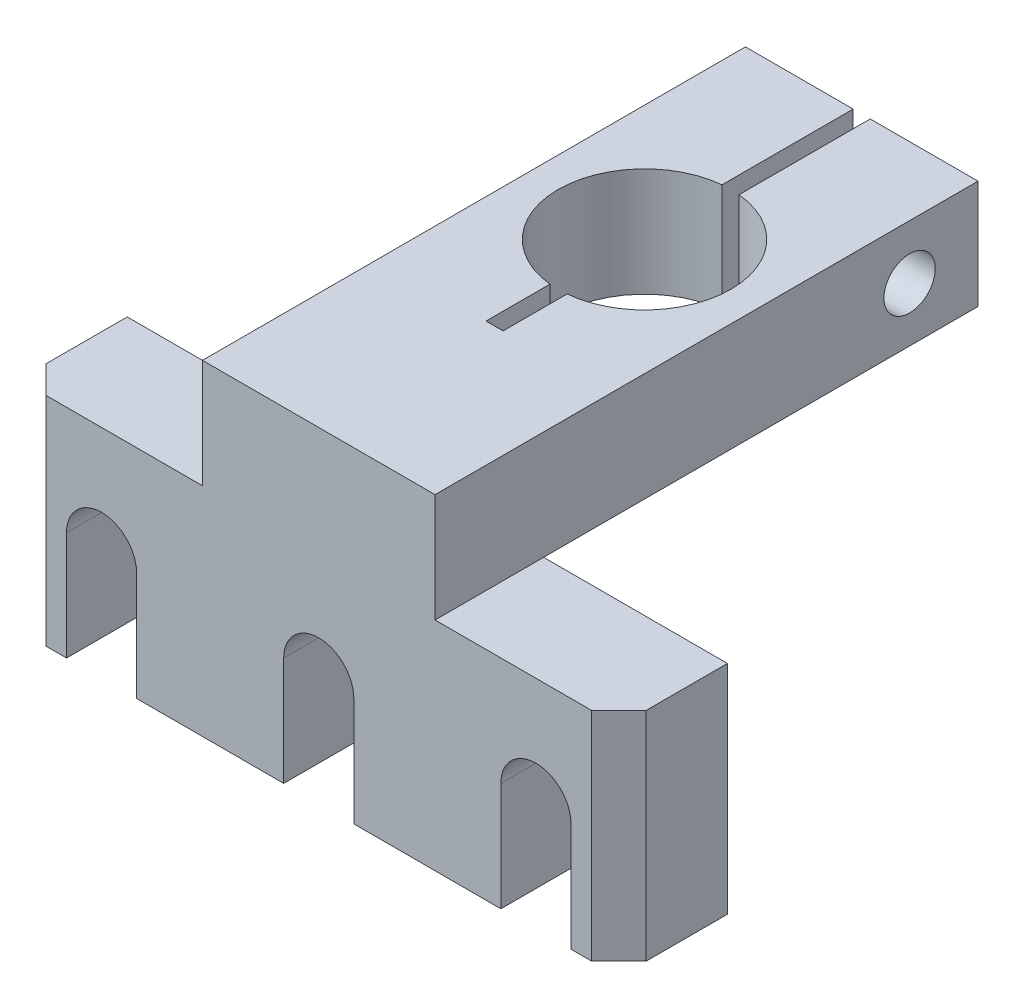
ISO-10303-21;
HEADER;
FILE_DESCRIPTION(('STEP AP214'),'2;1');
FILE_NAME('part.step','',(''),(''),'','','');
FILE_SCHEMA(('AUTOMOTIVE_DESIGN { 1 0 10303 214 1 1 1 1 }'));
ENDSEC;
DATA;
#1=APPLICATION_CONTEXT('core data for automotive mechanical design processes');
#2=APPLICATION_PROTOCOL_DEFINITION('international standard','automotive_design',2000,#1);
#3=PRODUCT_CONTEXT('',#1,'mechanical');
#4=PRODUCT('Part','Part','',(#3));
#5=PRODUCT_RELATED_PRODUCT_CATEGORY('part','',(#4));
#6=PRODUCT_DEFINITION_FORMATION('','',#4);
#7=PRODUCT_DEFINITION_CONTEXT('part definition',#1,'design');
#8=PRODUCT_DEFINITION('design','',#6,#7);
#9=PRODUCT_DEFINITION_SHAPE('','',#8);
#10=(LENGTH_UNIT() NAMED_UNIT(*) SI_UNIT(.MILLI.,.METRE.));
#11=(NAMED_UNIT(*) PLANE_ANGLE_UNIT() SI_UNIT($,.RADIAN.));
#12=(NAMED_UNIT(*) SI_UNIT($,.STERADIAN.) SOLID_ANGLE_UNIT());
#13=UNCERTAINTY_MEASURE_WITH_UNIT(LENGTH_MEASURE(1.E-05),#10,'distance_accuracy_value','');
#14=(GEOMETRIC_REPRESENTATION_CONTEXT(3) GLOBAL_UNCERTAINTY_ASSIGNED_CONTEXT((#13)) GLOBAL_UNIT_ASSIGNED_CONTEXT((#10,
#11,#12)) REPRESENTATION_CONTEXT('',''));
#15=CARTESIAN_POINT('',(0.,0.,0.));
#16=DIRECTION('',(0.,0.,1.));
#17=DIRECTION('',(1.,0.,0.));
#18=AXIS2_PLACEMENT_3D('',#15,#16,#17);
#19=CARTESIAN_POINT('',(18.05,19.050025,-3.93));
#20=DIRECTION('',(0.,0.,1.));
#21=DIRECTION('',(1.,0.,0.));
#22=AXIS2_PLACEMENT_3D('',#19,#20,#21);
#23=PLANE('',#22);
#24=DIRECTION('',(1.,0.,0.));
#25=VECTOR('',#24,1.);
#26=CARTESIAN_POINT('',(18.05,12.7,-3.93));
#27=LINE('',#26,#25);
#28=CARTESIAN_POINT('',(17.05,12.7,-3.93));
#29=VERTEX_POINT('',#28);
#30=CARTESIAN_POINT('',(18.05,12.7,-3.93));
#31=VERTEX_POINT('',#30);
#32=EDGE_CURVE('E236',#29,#31,#27,.T.);
#33=ORIENTED_EDGE('',*,*,#32,.F.);
#34=DIRECTION('',(0.,1.,0.));
#35=VECTOR('',#34,1.);
#36=CARTESIAN_POINT('',(17.05,19.050025,-3.93));
#37=LINE('',#36,#35);
#38=CARTESIAN_POINT('',(17.05,19.05,-3.93));
#39=VERTEX_POINT('',#38);
#40=EDGE_CURVE('E182',#29,#39,#37,.T.);
#41=ORIENTED_EDGE('',*,*,#40,.T.);
#42=DIRECTION('',(1.,0.,0.));
#43=VECTOR('',#42,1.);
#44=CARTESIAN_POINT('',(18.05,19.05,-3.93));
#45=LINE('',#44,#43);
#46=CARTESIAN_POINT('',(18.05,19.05,-3.93));
#47=VERTEX_POINT('',#46);
#48=EDGE_CURVE('E333',#47,#39,#45,.F.);
#49=ORIENTED_EDGE('',*,*,#48,.F.);
#50=DIRECTION('',(0.,1.,0.));
#51=VECTOR('',#50,1.);
#52=CARTESIAN_POINT('',(18.05,19.050025,-3.93));
#53=LINE('',#52,#51);
#54=EDGE_CURVE('E203',#47,#31,#53,.F.);
#55=ORIENTED_EDGE('',*,*,#54,.T.);
#56=EDGE_LOOP('',(#33,#41,#49,#55));
#57=FACE_BOUND('',#56,.T.);
#58=ADVANCED_FACE('F15',(#57),#23,.F.);
#59=CARTESIAN_POINT('',(35.1000250000001,15.875,-21.4));
#60=DIRECTION('',(-1.,0.,0.));
#61=DIRECTION('',(0.,0.,1.));
#62=AXIS2_PLACEMENT_3D('',#59,#60,#61);
#63=CYLINDRICAL_SURFACE('',#62,1.5);
#64=CARTESIAN_POINT('',(17.05,15.875,-21.4));
#65=DIRECTION('',(-1.,0.,0.));
#66=DIRECTION('',(0.,0.,1.));
#67=AXIS2_PLACEMENT_3D('',#64,#65,#66);
#68=CIRCLE('',#67,1.5);
#69=CARTESIAN_POINT('',(17.05,15.875,-19.9));
#70=VERTEX_POINT('',#69);
#71=EDGE_CURVE('E18',#70,#70,#68,.F.);
#72=ORIENTED_EDGE('',*,*,#71,.T.);
#73=EDGE_LOOP('',(#72));
#74=FACE_BOUND('',#73,.T.);
#75=CARTESIAN_POINT('',(10.75,15.875,-21.4));
#76=DIRECTION('',(-1.,0.,0.));
#77=DIRECTION('',(0.,0.,1.));
#78=AXIS2_PLACEMENT_3D('',#75,#76,#77);
#79=CIRCLE('',#78,1.5);
#80=CARTESIAN_POINT('',(10.75,15.875,-19.9));
#81=VERTEX_POINT('',#80);
#82=EDGE_CURVE('E324',#81,#81,#79,.T.);
#83=ORIENTED_EDGE('',*,*,#82,.T.);
#84=EDGE_LOOP('',(#83));
#85=FACE_BOUND('',#84,.T.);
#86=ADVANCED_FACE('F969',(#74,#85),#63,.F.);
#87=CARTESIAN_POINT('',(17.55,19.05,-12.7));
#88=DIRECTION('',(0.,-1.,0.));
#89=DIRECTION('',(0.,0.,-1.));
#90=AXIS2_PLACEMENT_3D('',#87,#88,#89);
#91=CYLINDRICAL_SURFACE('',#90,5.055);
#92=CARTESIAN_POINT('',(17.55,12.7,-12.7));
#93=DIRECTION('',(0.,-1.,0.));
#94=DIRECTION('',(0.,0.,-1.));
#95=AXIS2_PLACEMENT_3D('',#92,#93,#94);
#96=CIRCLE('',#95,5.055);
#97=CARTESIAN_POINT('',(17.05,12.7,-17.7302112281692));
#98=VERTEX_POINT('',#97);
#99=CARTESIAN_POINT('',(17.05,12.7,-7.66978877183075));
#100=VERTEX_POINT('',#99);
#101=EDGE_CURVE('E166',#98,#100,#96,.F.);
#102=ORIENTED_EDGE('',*,*,#101,.F.);
#103=DIRECTION('',(0.,1.,0.));
#104=VECTOR('',#103,1.);
#105=CARTESIAN_POINT('',(17.05,19.050025,-17.7302112281693));
#106=LINE('',#105,#104);
#107=CARTESIAN_POINT('',(17.05,19.05,-17.7302112281692));
#108=VERTEX_POINT('',#107);
#109=EDGE_CURVE('E160',#98,#108,#106,.T.);
#110=ORIENTED_EDGE('',*,*,#109,.T.);
#111=CARTESIAN_POINT('',(17.55,19.05,-12.7));
#112=DIRECTION('',(0.,-1.,0.));
#113=DIRECTION('',(0.,0.,-1.));
#114=AXIS2_PLACEMENT_3D('',#111,#112,#113);
#115=CIRCLE('',#114,5.055);
#116=CARTESIAN_POINT('',(17.05,19.05,-7.66978877183075));
#117=VERTEX_POINT('',#116);
#118=EDGE_CURVE('E178',#117,#108,#115,.T.);
#119=ORIENTED_EDGE('',*,*,#118,.F.);
#120=DIRECTION('',(0.,1.,0.));
#121=VECTOR('',#120,1.);
#122=CARTESIAN_POINT('',(17.05,19.050025,-7.66978877183074));
#123=LINE('',#122,#121);
#124=EDGE_CURVE('E176',#117,#100,#123,.F.);
#125=ORIENTED_EDGE('',*,*,#124,.T.);
#126=EDGE_LOOP('',(#102,#110,#119,#125));
#127=FACE_BOUND('',#126,.T.);
#128=ADVANCED_FACE('F177',(#127),#91,.F.);
#129=CARTESIAN_POINT('',(17.05,19.050025,-25.4));
#130=DIRECTION('',(-1.,0.,0.));
#131=DIRECTION('',(0.,0.,1.));
#132=AXIS2_PLACEMENT_3D('',#129,#130,#131);
#133=PLANE('',#132);
#134=ORIENTED_EDGE('',*,*,#71,.F.);
#135=EDGE_LOOP('',(#134));
#136=FACE_BOUND('',#135,.T.);
#137=DIRECTION('',(0.,0.,-1.));
#138=VECTOR('',#137,1.);
#139=CARTESIAN_POINT('',(17.05,12.7,-25.4));
#140=LINE('',#139,#138);
#141=CARTESIAN_POINT('',(17.05,12.7,-25.4));
#142=VERTEX_POINT('',#141);
#143=EDGE_CURVE('E172',#142,#98,#140,.F.);
#144=ORIENTED_EDGE('',*,*,#143,.F.);
#145=DIRECTION('',(0.,1.,0.));
#146=VECTOR('',#145,1.);
#147=CARTESIAN_POINT('',(17.05,0.,-25.4));
#148=LINE('',#147,#146);
#149=CARTESIAN_POINT('',(17.05,19.05,-25.4));
#150=VERTEX_POINT('',#149);
#151=EDGE_CURVE('E211',#150,#142,#148,.F.);
#152=ORIENTED_EDGE('',*,*,#151,.F.);
#153=DIRECTION('',(0.,0.,1.));
#154=VECTOR('',#153,1.);
#155=CARTESIAN_POINT('',(17.05,19.05,-25.4));
#156=LINE('',#155,#154);
#157=EDGE_CURVE('E243',#108,#150,#156,.F.);
#158=ORIENTED_EDGE('',*,*,#157,.F.);
#159=ORIENTED_EDGE('',*,*,#109,.F.);
#160=EDGE_LOOP('',(#144,#152,#158,#159));
#161=FACE_BOUND('',#160,.T.);
#162=ADVANCED_FACE('F644',(#136,#161),#133,.F.);
#163=CARTESIAN_POINT('',(0.,0.,-25.4));
#164=DIRECTION('',(0.,0.,-1.));
#165=DIRECTION('',(-1.,0.,0.));
#166=AXIS2_PLACEMENT_3D('',#163,#164,#165);
#167=PLANE('',#166);
#168=ORIENTED_EDGE('',*,*,#151,.T.);
#169=DIRECTION('',(1.,0.,0.));
#170=VECTOR('',#169,1.);
#171=CARTESIAN_POINT('',(11.75,12.7,-25.4));
#172=LINE('',#171,#170);
#173=CARTESIAN_POINT('',(10.75,12.7,-25.4));
#174=VERTEX_POINT('',#173);
#175=EDGE_CURVE('E309',#174,#142,#172,.T.);
#176=ORIENTED_EDGE('',*,*,#175,.F.);
#177=DIRECTION('',(0.,1.,0.));
#178=VECTOR('',#177,1.);
#179=CARTESIAN_POINT('',(10.75,0.,-25.4));
#180=LINE('',#179,#178);
#181=CARTESIAN_POINT('',(10.75,19.05,-25.4));
#182=VERTEX_POINT('',#181);
#183=EDGE_CURVE('E314',#174,#182,#180,.T.);
#184=ORIENTED_EDGE('',*,*,#183,.T.);
#185=DIRECTION('',(1.,0.,0.));
#186=VECTOR('',#185,1.);
#187=CARTESIAN_POINT('',(11.75,19.05,-25.4));
#188=LINE('',#187,#186);
#189=EDGE_CURVE('E240',#150,#182,#188,.F.);
#190=ORIENTED_EDGE('',*,*,#189,.F.);
#191=EDGE_LOOP('',(#168,#176,#184,#190));
#192=FACE_BOUND('',#191,.T.);
#193=ADVANCED_FACE('F642',(#192),#167,.T.);
#194=CARTESIAN_POINT('',(18.05,19.050025,-25.4));
#195=DIRECTION('',(1.,0.,0.));
#196=DIRECTION('',(0.,0.,-1.));
#197=AXIS2_PLACEMENT_3D('',#194,#195,#196);
#198=PLANE('',#197);
#199=CARTESIAN_POINT('',(18.05,15.875,-21.4));
#200=DIRECTION('',(-1.,0.,0.));
#201=DIRECTION('',(0.,0.,1.));
#202=AXIS2_PLACEMENT_3D('',#199,#200,#201);
#203=CIRCLE('',#202,1.5);
#204=CARTESIAN_POINT('',(18.05,15.875,-19.9));
#205=VERTEX_POINT('',#204);
#206=EDGE_CURVE('E270',#205,#205,#203,.F.);
#207=ORIENTED_EDGE('',*,*,#206,.T.);
#208=EDGE_LOOP('',(#207));
#209=FACE_BOUND('',#208,.T.);
#210=DIRECTION('',(0.,0.,1.));
#211=VECTOR('',#210,1.);
#212=CARTESIAN_POINT('',(18.05,19.05,-25.4));
#213=LINE('',#212,#211);
#214=CARTESIAN_POINT('',(18.05,19.05,-25.4));
#215=VERTEX_POINT('',#214);
#216=CARTESIAN_POINT('',(18.05,19.05,-17.7302112281692));
#217=VERTEX_POINT('',#216);
#218=EDGE_CURVE('E215',#215,#217,#213,.T.);
#219=ORIENTED_EDGE('',*,*,#218,.F.);
#220=DIRECTION('',(0.,1.,0.));
#221=VECTOR('',#220,1.);
#222=CARTESIAN_POINT('',(18.05,0.,-25.4));
#223=LINE('',#222,#221);
#224=CARTESIAN_POINT('',(18.05,12.7,-25.4));
#225=VERTEX_POINT('',#224);
#226=EDGE_CURVE('E174',#225,#215,#223,.T.);
#227=ORIENTED_EDGE('',*,*,#226,.F.);
#228=DIRECTION('',(0.,0.,-1.));
#229=VECTOR('',#228,1.);
#230=CARTESIAN_POINT('',(18.05,12.7,-25.4));
#231=LINE('',#230,#229);
#232=CARTESIAN_POINT('',(18.05,12.7,-17.7302112281692));
#233=VERTEX_POINT('',#232);
#234=EDGE_CURVE('E329',#233,#225,#231,.T.);
#235=ORIENTED_EDGE('',*,*,#234,.F.);
#236=DIRECTION('',(0.,-1.,0.));
#237=VECTOR('',#236,1.);
#238=CARTESIAN_POINT('',(18.05,19.05,-17.7302112281692));
#239=LINE('',#238,#237);
#240=EDGE_CURVE('E206',#233,#217,#239,.F.);
#241=ORIENTED_EDGE('',*,*,#240,.T.);
#242=EDGE_LOOP('',(#219,#227,#235,#241));
#243=FACE_BOUND('',#242,.T.);
#244=ADVANCED_FACE('F657',(#209,#243),#198,.F.);
#245=CARTESIAN_POINT('',(17.55,19.05,-12.7));
#246=DIRECTION('',(0.,-1.,0.));
#247=DIRECTION('',(0.,0.,-1.));
#248=AXIS2_PLACEMENT_3D('',#245,#246,#247);
#249=CYLINDRICAL_SURFACE('',#248,5.055);
#250=CARTESIAN_POINT('',(17.55,12.7,-12.7));
#251=DIRECTION('',(0.,-1.,0.));
#252=DIRECTION('',(0.,0.,-1.));
#253=AXIS2_PLACEMENT_3D('',#250,#251,#252);
#254=CIRCLE('',#253,5.055);
#255=CARTESIAN_POINT('',(18.05,12.7,-7.66978877183075));
#256=VERTEX_POINT('',#255);
#257=EDGE_CURVE('E190',#256,#233,#254,.F.);
#258=ORIENTED_EDGE('',*,*,#257,.F.);
#259=DIRECTION('',(0.,1.,0.));
#260=VECTOR('',#259,1.);
#261=CARTESIAN_POINT('',(18.05,19.050025,-7.66978877183074));
#262=LINE('',#261,#260);
#263=CARTESIAN_POINT('',(18.05,19.05,-7.66978877183075));
#264=VERTEX_POINT('',#263);
#265=EDGE_CURVE('E198',#256,#264,#262,.T.);
#266=ORIENTED_EDGE('',*,*,#265,.T.);
#267=CARTESIAN_POINT('',(17.55,19.05,-12.7));
#268=DIRECTION('',(0.,-1.,0.));
#269=DIRECTION('',(0.,0.,-1.));
#270=AXIS2_PLACEMENT_3D('',#267,#268,#269);
#271=CIRCLE('',#270,5.055);
#272=EDGE_CURVE('E366',#217,#264,#271,.T.);
#273=ORIENTED_EDGE('',*,*,#272,.F.);
#274=ORIENTED_EDGE('',*,*,#240,.F.);
#275=EDGE_LOOP('',(#258,#266,#273,#274));
#276=FACE_BOUND('',#275,.T.);
#277=ADVANCED_FACE('F653',(#276),#249,.F.);
#278=CARTESIAN_POINT('',(18.05,19.050025,-25.4));
#279=DIRECTION('',(1.,0.,0.));
#280=DIRECTION('',(0.,0.,-1.));
#281=AXIS2_PLACEMENT_3D('',#278,#279,#280);
#282=PLANE('',#281);
#283=DIRECTION('',(0.,0.,-1.));
#284=VECTOR('',#283,1.);
#285=CARTESIAN_POINT('',(18.05,12.7,-25.4));
#286=LINE('',#285,#284);
#287=EDGE_CURVE('E187',#31,#256,#286,.T.);
#288=ORIENTED_EDGE('',*,*,#287,.F.);
#289=ORIENTED_EDGE('',*,*,#54,.F.);
#290=DIRECTION('',(0.,0.,1.));
#291=VECTOR('',#290,1.);
#292=CARTESIAN_POINT('',(18.05,19.05,-25.4));
#293=LINE('',#292,#291);
#294=EDGE_CURVE('E368',#264,#47,#293,.T.);
#295=ORIENTED_EDGE('',*,*,#294,.F.);
#296=ORIENTED_EDGE('',*,*,#265,.F.);
#297=EDGE_LOOP('',(#288,#289,#295,#296));
#298=FACE_BOUND('',#297,.T.);
#299=ADVANCED_FACE('F924',(#298),#282,.F.);
#300=CARTESIAN_POINT('',(17.05,19.050025,-25.4));
#301=DIRECTION('',(-1.,0.,0.));
#302=DIRECTION('',(0.,0.,1.));
#303=AXIS2_PLACEMENT_3D('',#300,#301,#302);
#304=PLANE('',#303);
#305=DIRECTION('',(0.,0.,1.));
#306=VECTOR('',#305,1.);
#307=CARTESIAN_POINT('',(17.05,19.05,-25.4));
#308=LINE('',#307,#306);
#309=EDGE_CURVE('E226',#39,#117,#308,.F.);
#310=ORIENTED_EDGE('',*,*,#309,.F.);
#311=ORIENTED_EDGE('',*,*,#40,.F.);
#312=DIRECTION('',(0.,0.,-1.));
#313=VECTOR('',#312,1.);
#314=CARTESIAN_POINT('',(17.05,12.7,-25.4));
#315=LINE('',#314,#313);
#316=EDGE_CURVE('E171',#100,#29,#315,.F.);
#317=ORIENTED_EDGE('',*,*,#316,.F.);
#318=ORIENTED_EDGE('',*,*,#124,.F.);
#319=EDGE_LOOP('',(#310,#311,#317,#318));
#320=FACE_BOUND('',#319,.T.);
#321=ADVANCED_FACE('F185',(#320),#304,.F.);
#322=CARTESIAN_POINT('',(0.,0.,-25.4));
#323=DIRECTION('',(0.,0.,-1.));
#324=DIRECTION('',(-1.,0.,0.));
#325=AXIS2_PLACEMENT_3D('',#322,#323,#324);
#326=PLANE('',#325);
#327=ORIENTED_EDGE('',*,*,#226,.T.);
#328=DIRECTION('',(1.,0.,0.));
#329=VECTOR('',#328,1.);
#330=CARTESIAN_POINT('',(11.75,19.05,-25.4));
#331=LINE('',#330,#329);
#332=CARTESIAN_POINT('',(24.35,19.05,-25.4));
#333=VERTEX_POINT('',#332);
#334=EDGE_CURVE('E212',#333,#215,#331,.F.);
#335=ORIENTED_EDGE('',*,*,#334,.F.);
#336=DIRECTION('',(0.,1.,0.));
#337=VECTOR('',#336,1.);
#338=CARTESIAN_POINT('',(24.35,0.,-25.4));
#339=LINE('',#338,#337);
#340=CARTESIAN_POINT('',(24.35,12.7,-25.4));
#341=VERTEX_POINT('',#340);
#342=EDGE_CURVE('E222',#333,#341,#339,.F.);
#343=ORIENTED_EDGE('',*,*,#342,.T.);
#344=DIRECTION('',(1.,0.,0.));
#345=VECTOR('',#344,1.);
#346=CARTESIAN_POINT('',(11.75,12.7,-25.4));
#347=LINE('',#346,#345);
#348=EDGE_CURVE('E311',#225,#341,#347,.T.);
#349=ORIENTED_EDGE('',*,*,#348,.F.);
#350=EDGE_LOOP('',(#327,#335,#343,#349));
#351=FACE_BOUND('',#350,.T.);
#352=ADVANCED_FACE('F661',(#351),#326,.T.);
#353=CARTESIAN_POINT('',(11.75,12.7,-25.4));
#354=DIRECTION('',(0.,-1.,0.));
#355=DIRECTION('',(0.,0.,-1.));
#356=AXIS2_PLACEMENT_3D('',#353,#354,#355);
#357=PLANE('',#356);
#358=ORIENTED_EDGE('',*,*,#175,.T.);
#359=ORIENTED_EDGE('',*,*,#143,.T.);
#360=ORIENTED_EDGE('',*,*,#101,.T.);
#361=ORIENTED_EDGE('',*,*,#316,.T.);
#362=ORIENTED_EDGE('',*,*,#32,.T.);
#363=ORIENTED_EDGE('',*,*,#287,.T.);
#364=ORIENTED_EDGE('',*,*,#257,.T.);
#365=ORIENTED_EDGE('',*,*,#234,.T.);
#366=ORIENTED_EDGE('',*,*,#348,.T.);
#367=DIRECTION('',(0.,0.,1.));
#368=VECTOR('',#367,1.);
#369=CARTESIAN_POINT('',(24.35,12.7,0.));
#370=LINE('',#369,#368);
#371=CARTESIAN_POINT('',(24.35,12.7,0.));
#372=VERTEX_POINT('',#371);
#373=EDGE_CURVE('E225',#341,#372,#370,.T.);
#374=ORIENTED_EDGE('',*,*,#373,.T.);
#375=DIRECTION('',(-1.,0.,0.));
#376=VECTOR('',#375,1.);
#377=CARTESIAN_POINT('',(0.,12.7,0.));
#378=LINE('',#377,#376);
#379=CARTESIAN_POINT('',(10.75,12.7,0.));
#380=VERTEX_POINT('',#379);
#381=EDGE_CURVE('E276',#380,#372,#378,.F.);
#382=ORIENTED_EDGE('',*,*,#381,.F.);
#383=DIRECTION('',(0.,0.,-1.));
#384=VECTOR('',#383,1.);
#385=CARTESIAN_POINT('',(10.75,12.7,0.));
#386=LINE('',#385,#384);
#387=EDGE_CURVE('E321',#380,#174,#386,.T.);
#388=ORIENTED_EDGE('',*,*,#387,.T.);
#389=EDGE_LOOP('',(#358,#359,#360,#361,#362,#363,#364,#365,#366,#374,#382,#388));
#390=FACE_BOUND('',#389,.T.);
#391=ADVANCED_FACE('F169',(#390),#357,.T.);
#392=CARTESIAN_POINT('',(35.1000250000001,15.875,-21.4));
#393=DIRECTION('',(-1.,0.,0.));
#394=DIRECTION('',(0.,0.,1.));
#395=AXIS2_PLACEMENT_3D('',#392,#393,#394);
#396=CYLINDRICAL_SURFACE('',#395,1.5);
#397=CARTESIAN_POINT('',(24.35,15.875,-21.4));
#398=DIRECTION('',(-1.,0.,0.));
#399=DIRECTION('',(0.,0.,1.));
#400=AXIS2_PLACEMENT_3D('',#397,#398,#399);
#401=CIRCLE('',#400,1.5);
#402=CARTESIAN_POINT('',(24.35,15.875,-19.9));
#403=VERTEX_POINT('',#402);
#404=EDGE_CURVE('E232',#403,#403,#401,.F.);
#405=ORIENTED_EDGE('',*,*,#404,.T.);
#406=EDGE_LOOP('',(#405));
#407=FACE_BOUND('',#406,.T.);
#408=ORIENTED_EDGE('',*,*,#206,.F.);
#409=EDGE_LOOP('',(#408));
#410=FACE_BOUND('',#409,.T.);
#411=ADVANCED_FACE('F894',(#407,#410),#396,.F.);
#412=CARTESIAN_POINT('',(35.1000000000001,0.,6.35));
#413=DIRECTION('',(-1.,0.,0.));
#414=DIRECTION('',(0.,0.,1.));
#415=AXIS2_PLACEMENT_3D('',#412,#413,#414);
#416=PLANE('',#415);
#417=DIRECTION('',(0.,0.,1.));
#418=VECTOR('',#417,1.);
#419=CARTESIAN_POINT('',(35.1000000000001,0.,6.35));
#420=LINE('',#419,#418);
#421=CARTESIAN_POINT('',(35.1000000000001,0.,4.75000000000001));
#422=VERTEX_POINT('',#421);
#423=CARTESIAN_POINT('',(35.1000000000001,0.,0.));
#424=VERTEX_POINT('',#423);
#425=EDGE_CURVE('E266',#422,#424,#420,.F.);
#426=ORIENTED_EDGE('',*,*,#425,.T.);
#427=DIRECTION('',(0.,1.,0.));
#428=VECTOR('',#427,1.);
#429=CARTESIAN_POINT('',(35.1000000000001,0.,0.));
#430=LINE('',#429,#428);
#431=CARTESIAN_POINT('',(35.1000000000001,12.7,0.));
#432=VERTEX_POINT('',#431);
#433=EDGE_CURVE('E273',#432,#424,#430,.F.);
#434=ORIENTED_EDGE('',*,*,#433,.F.);
#435=DIRECTION('',(0.,0.,-1.));
#436=VECTOR('',#435,1.);
#437=CARTESIAN_POINT('',(35.1000000000001,12.7,6.35));
#438=LINE('',#437,#436);
#439=CARTESIAN_POINT('',(35.1000000000001,12.7,4.75));
#440=VERTEX_POINT('',#439);
#441=EDGE_CURVE('E279',#432,#440,#438,.F.);
#442=ORIENTED_EDGE('',*,*,#441,.T.);
#443=DIRECTION('',(0.,1.,0.));
#444=VECTOR('',#443,1.);
#445=CARTESIAN_POINT('',(35.1000000000001,0.,4.75000000000002));
#446=LINE('',#445,#444);
#447=EDGE_CURVE('E303',#440,#422,#446,.F.);
#448=ORIENTED_EDGE('',*,*,#447,.T.);
#449=EDGE_LOOP('',(#426,#434,#442,#448));
#450=FACE_BOUND('',#449,.T.);
#451=ADVANCED_FACE('F684',(#450),#416,.F.);
#452=CARTESIAN_POINT('',(0.,0.,6.35));
#453=DIRECTION('',(0.,1.,0.));
#454=DIRECTION('',(0.,0.,1.));
#455=AXIS2_PLACEMENT_3D('',#452,#453,#454);
#456=PLANE('',#455);
#457=DIRECTION('',(1.,0.,0.));
#458=VECTOR('',#457,1.);
#459=CARTESIAN_POINT('',(0.,0.,6.35));
#460=LINE('',#459,#458);
#461=CARTESIAN_POINT('',(32.3000000000001,0.,6.35));
#462=VERTEX_POINT('',#461);
#463=CARTESIAN_POINT('',(33.5000000000001,0.,6.35));
#464=VERTEX_POINT('',#463);
#465=EDGE_CURVE('E269',#462,#464,#460,.T.);
#466=ORIENTED_EDGE('',*,*,#465,.F.);
#467=DIRECTION('',(0.,0.,-1.));
#468=VECTOR('',#467,1.);
#469=CARTESIAN_POINT('',(32.3000000000001,0.,6.35005));
#470=LINE('',#469,#468);
#471=CARTESIAN_POINT('',(32.3000000000001,0.,0.));
#472=VERTEX_POINT('',#471);
#473=EDGE_CURVE('E306',#462,#472,#470,.T.);
#474=ORIENTED_EDGE('',*,*,#473,.T.);
#475=DIRECTION('',(-1.,0.,0.));
#476=VECTOR('',#475,1.);
#477=CARTESIAN_POINT('',(0.,0.,0.));
#478=LINE('',#477,#476);
#479=EDGE_CURVE('E275',#424,#472,#478,.T.);
#480=ORIENTED_EDGE('',*,*,#479,.F.);
#481=ORIENTED_EDGE('',*,*,#425,.F.);
#482=DIRECTION('',(-0.707106781186546,0.,0.707106781186549));
#483=VECTOR('',#482,1.);
#484=CARTESIAN_POINT('',(33.5000000000001,0.,6.35));
#485=LINE('',#484,#483);
#486=EDGE_CURVE('E282',#422,#464,#485,.T.);
#487=ORIENTED_EDGE('',*,*,#486,.T.);
#488=EDGE_LOOP('',(#466,#474,#480,#481,#487));
#489=FACE_BOUND('',#488,.T.);
#490=ADVANCED_FACE('F686',(#489),#456,.F.);
#491=CARTESIAN_POINT('',(0.,0.,0.));
#492=DIRECTION('',(0.,0.,-1.));
#493=DIRECTION('',(-1.,0.,0.));
#494=AXIS2_PLACEMENT_3D('',#491,#492,#493);
#495=PLANE('',#494);
#496=ORIENTED_EDGE('',*,*,#433,.T.);
#497=ORIENTED_EDGE('',*,*,#479,.T.);
#498=DIRECTION('',(0.,1.,0.));
#499=VECTOR('',#498,1.);
#500=CARTESIAN_POINT('',(32.3000000000001,6.35,0.));
#501=LINE('',#500,#499);
#502=CARTESIAN_POINT('',(32.3,6.35,0.));
#503=VERTEX_POINT('',#502);
#504=EDGE_CURVE('E393',#472,#503,#501,.T.);
#505=ORIENTED_EDGE('',*,*,#504,.T.);
#506=CARTESIAN_POINT('',(30.2499999999999,6.35,0.));
#507=DIRECTION('',(0.,0.,-1.));
#508=DIRECTION('',(-1.,0.,0.));
#509=AXIS2_PLACEMENT_3D('',#506,#507,#508);
#510=CIRCLE('',#509,2.05);
#511=CARTESIAN_POINT('',(28.2,6.35,0.));
#512=VERTEX_POINT('',#511);
#513=EDGE_CURVE('E360',#503,#512,#510,.F.);
#514=ORIENTED_EDGE('',*,*,#513,.T.);
#515=DIRECTION('',(0.,-1.,0.));
#516=VECTOR('',#515,1.);
#517=CARTESIAN_POINT('',(28.2,6.35,0.));
#518=LINE('',#517,#516);
#519=CARTESIAN_POINT('',(28.2,0.,0.));
#520=VERTEX_POINT('',#519);
#521=EDGE_CURVE('E397',#512,#520,#518,.T.);
#522=ORIENTED_EDGE('',*,*,#521,.T.);
#523=DIRECTION('',(1.,0.,0.));
#524=VECTOR('',#523,1.);
#525=CARTESIAN_POINT('',(0.,0.,0.));
#526=LINE('',#525,#524);
#527=CARTESIAN_POINT('',(19.6,0.,0.));
#528=VERTEX_POINT('',#527);
#529=EDGE_CURVE('E400',#520,#528,#526,.F.);
#530=ORIENTED_EDGE('',*,*,#529,.T.);
#531=DIRECTION('',(0.,1.,0.));
#532=VECTOR('',#531,1.);
#533=CARTESIAN_POINT('',(19.6,6.35,0.));
#534=LINE('',#533,#532);
#535=CARTESIAN_POINT('',(19.6,6.35,0.));
#536=VERTEX_POINT('',#535);
#537=EDGE_CURVE('E408',#528,#536,#534,.T.);
#538=ORIENTED_EDGE('',*,*,#537,.T.);
#539=CARTESIAN_POINT('',(17.55,6.35,0.));
#540=DIRECTION('',(0.,0.,-1.));
#541=DIRECTION('',(-1.,0.,0.));
#542=AXIS2_PLACEMENT_3D('',#539,#540,#541);
#543=CIRCLE('',#542,2.05);
#544=CARTESIAN_POINT('',(15.5,6.35,0.));
#545=VERTEX_POINT('',#544);
#546=EDGE_CURVE('E356',#536,#545,#543,.F.);
#547=ORIENTED_EDGE('',*,*,#546,.T.);
#548=DIRECTION('',(0.,1.,0.));
#549=VECTOR('',#548,1.);
#550=CARTESIAN_POINT('',(15.5,0.,0.));
#551=LINE('',#550,#549);
#552=CARTESIAN_POINT('',(15.5,0.,0.));
#553=VERTEX_POINT('',#552);
#554=EDGE_CURVE('E413',#545,#553,#551,.F.);
#555=ORIENTED_EDGE('',*,*,#554,.T.);
#556=DIRECTION('',(1.,0.,0.));
#557=VECTOR('',#556,1.);
#558=CARTESIAN_POINT('',(0.,0.,0.));
#559=LINE('',#558,#557);
#560=CARTESIAN_POINT('',(6.90000000000001,0.,0.));
#561=VERTEX_POINT('',#560);
#562=EDGE_CURVE('E416',#553,#561,#559,.F.);
#563=ORIENTED_EDGE('',*,*,#562,.T.);
#564=DIRECTION('',(0.,1.,0.));
#565=VECTOR('',#564,1.);
#566=CARTESIAN_POINT('',(6.90000000000001,6.35,0.));
#567=LINE('',#566,#565);
#568=CARTESIAN_POINT('',(6.90000000000001,6.35,0.));
#569=VERTEX_POINT('',#568);
#570=EDGE_CURVE('E424',#561,#569,#567,.T.);
#571=ORIENTED_EDGE('',*,*,#570,.T.);
#572=CARTESIAN_POINT('',(4.85,6.35,0.));
#573=DIRECTION('',(0.,0.,-1.));
#574=DIRECTION('',(-1.,0.,0.));
#575=AXIS2_PLACEMENT_3D('',#572,#573,#574);
#576=CIRCLE('',#575,2.05);
#577=CARTESIAN_POINT('',(2.8,6.35,0.));
#578=VERTEX_POINT('',#577);
#579=EDGE_CURVE('E352',#569,#578,#576,.F.);
#580=ORIENTED_EDGE('',*,*,#579,.T.);
#581=DIRECTION('',(0.,1.,0.));
#582=VECTOR('',#581,1.);
#583=CARTESIAN_POINT('',(2.8,6.35,0.));
#584=LINE('',#583,#582);
#585=CARTESIAN_POINT('',(2.8,0.,0.));
#586=VERTEX_POINT('',#585);
#587=EDGE_CURVE('E436',#578,#586,#584,.F.);
#588=ORIENTED_EDGE('',*,*,#587,.T.);
#589=DIRECTION('',(1.,0.,0.));
#590=VECTOR('',#589,1.);
#591=CARTESIAN_POINT('',(0.,0.,0.));
#592=LINE('',#591,#590);
#593=CARTESIAN_POINT('',(0.,0.,0.));
#594=VERTEX_POINT('',#593);
#595=EDGE_CURVE('E255',#586,#594,#592,.F.);
#596=ORIENTED_EDGE('',*,*,#595,.T.);
#597=DIRECTION('',(0.,1.,0.));
#598=VECTOR('',#597,1.);
#599=CARTESIAN_POINT('',(0.,0.,0.));
#600=LINE('',#599,#598);
#601=CARTESIAN_POINT('',(0.,12.7,0.));
#602=VERTEX_POINT('',#601);
#603=EDGE_CURVE('E246',#594,#602,#600,.T.);
#604=ORIENTED_EDGE('',*,*,#603,.T.);
#605=DIRECTION('',(1.,0.,0.));
#606=VECTOR('',#605,1.);
#607=CARTESIAN_POINT('',(0.,12.7,0.));
#608=LINE('',#607,#606);
#609=EDGE_CURVE('E318',#602,#380,#608,.T.);
#610=ORIENTED_EDGE('',*,*,#609,.T.);
#611=ORIENTED_EDGE('',*,*,#381,.T.);
#612=DIRECTION('',(1.,0.,0.));
#613=VECTOR('',#612,1.);
#614=CARTESIAN_POINT('',(0.,12.7,0.));
#615=LINE('',#614,#613);
#616=EDGE_CURVE('E283',#372,#432,#615,.T.);
#617=ORIENTED_EDGE('',*,*,#616,.T.);
#618=EDGE_LOOP('',(#496,#497,#505,#514,#522,#530,#538,#547,#555,#563,#571,#580,#588,#596,#604,
#610,#611,#617));
#619=FACE_BOUND('',#618,.T.);
#620=ADVANCED_FACE('F601',(#619),#495,.T.);
#621=CARTESIAN_POINT('',(0.,0.,6.35));
#622=DIRECTION('',(0.,1.,0.));
#623=DIRECTION('',(0.,0.,1.));
#624=AXIS2_PLACEMENT_3D('',#621,#622,#623);
#625=PLANE('',#624);
#626=DIRECTION('',(0.,0.,-1.));
#627=VECTOR('',#626,1.);
#628=CARTESIAN_POINT('',(0.,0.,6.35));
#629=LINE('',#628,#627);
#630=CARTESIAN_POINT('',(0.,0.,4.75));
#631=VERTEX_POINT('',#630);
#632=EDGE_CURVE('E250',#631,#594,#629,.T.);
#633=ORIENTED_EDGE('',*,*,#632,.T.);
#634=ORIENTED_EDGE('',*,*,#595,.F.);
#635=DIRECTION('',(0.,0.,1.));
#636=VECTOR('',#635,1.);
#637=CARTESIAN_POINT('',(2.8,0.,6.35005));
#638=LINE('',#637,#636);
#639=CARTESIAN_POINT('',(2.8,0.,6.35));
#640=VERTEX_POINT('',#639);
#641=EDGE_CURVE('E354',#586,#640,#638,.T.);
#642=ORIENTED_EDGE('',*,*,#641,.T.);
#643=DIRECTION('',(1.,0.,0.));
#644=VECTOR('',#643,1.);
#645=CARTESIAN_POINT('',(0.,0.,6.35));
#646=LINE('',#645,#644);
#647=CARTESIAN_POINT('',(1.6,0.,6.35));
#648=VERTEX_POINT('',#647);
#649=EDGE_CURVE('E33',#648,#640,#646,.T.);
#650=ORIENTED_EDGE('',*,*,#649,.F.);
#651=DIRECTION('',(-0.707106781186546,0.,-0.707106781186549));
#652=VECTOR('',#651,1.);
#653=CARTESIAN_POINT('',(1.6,0.,6.35));
#654=LINE('',#653,#652);
#655=EDGE_CURVE('E258',#648,#631,#654,.T.);
#656=ORIENTED_EDGE('',*,*,#655,.T.);
#657=EDGE_LOOP('',(#633,#634,#642,#650,#656));
#658=FACE_BOUND('',#657,.T.);
#659=ADVANCED_FACE('F597',(#658),#625,.F.);
#660=CARTESIAN_POINT('',(0.,0.,6.35));
#661=DIRECTION('',(1.,0.,0.));
#662=DIRECTION('',(0.,0.,-1.));
#663=AXIS2_PLACEMENT_3D('',#660,#661,#662);
#664=PLANE('',#663);
#665=DIRECTION('',(0.,0.,-1.));
#666=VECTOR('',#665,1.);
#667=CARTESIAN_POINT('',(0.,12.7,6.35));
#668=LINE('',#667,#666);
#669=CARTESIAN_POINT('',(0.,12.7,4.75));
#670=VERTEX_POINT('',#669);
#671=EDGE_CURVE('E249',#670,#602,#668,.T.);
#672=ORIENTED_EDGE('',*,*,#671,.T.);
#673=ORIENTED_EDGE('',*,*,#603,.F.);
#674=ORIENTED_EDGE('',*,*,#632,.F.);
#675=DIRECTION('',(0.,1.,0.));
#676=VECTOR('',#675,1.);
#677=CARTESIAN_POINT('',(0.,0.,4.75));
#678=LINE('',#677,#676);
#679=EDGE_CURVE('E260',#631,#670,#678,.T.);
#680=ORIENTED_EDGE('',*,*,#679,.T.);
#681=EDGE_LOOP('',(#672,#673,#674,#680));
#682=FACE_BOUND('',#681,.T.);
#683=ADVANCED_FACE('F604',(#682),#664,.F.);
#684=CARTESIAN_POINT('',(0.,12.7,6.35));
#685=DIRECTION('',(0.,-1.,0.));
#686=DIRECTION('',(0.,0.,-1.));
#687=AXIS2_PLACEMENT_3D('',#684,#685,#686);
#688=PLANE('',#687);
#689=DIRECTION('',(-1.,0.,0.));
#690=VECTOR('',#689,1.);
#691=CARTESIAN_POINT('',(0.,12.7,6.35));
#692=LINE('',#691,#690);
#693=CARTESIAN_POINT('',(1.6,12.7,6.35));
#694=VERTEX_POINT('',#693);
#695=CARTESIAN_POINT('',(10.75,12.7,6.35));
#696=VERTEX_POINT('',#695);
#697=EDGE_CURVE('E518',#694,#696,#692,.F.);
#698=ORIENTED_EDGE('',*,*,#697,.T.);
#699=DIRECTION('',(0.,0.,-1.));
#700=VECTOR('',#699,1.);
#701=CARTESIAN_POINT('',(10.75,12.7,0.));
#702=LINE('',#701,#700);
#703=EDGE_CURVE('E317',#696,#380,#702,.T.);
#704=ORIENTED_EDGE('',*,*,#703,.T.);
#705=ORIENTED_EDGE('',*,*,#609,.F.);
#706=ORIENTED_EDGE('',*,*,#671,.F.);
#707=DIRECTION('',(-0.707106781186546,0.,-0.707106781186549));
#708=VECTOR('',#707,1.);
#709=CARTESIAN_POINT('',(1.6,12.7,6.35));
#710=LINE('',#709,#708);
#711=EDGE_CURVE('E261',#670,#694,#710,.F.);
#712=ORIENTED_EDGE('',*,*,#711,.T.);
#713=EDGE_LOOP('',(#698,#704,#705,#706,#712));
#714=FACE_BOUND('',#713,.T.);
#715=ADVANCED_FACE('F611',(#714),#688,.F.);
#716=CARTESIAN_POINT('',(10.75,0.,0.));
#717=DIRECTION('',(1.,0.,0.));
#718=DIRECTION('',(0.,0.,-1.));
#719=AXIS2_PLACEMENT_3D('',#716,#717,#718);
#720=PLANE('',#719);
#721=ORIENTED_EDGE('',*,*,#82,.F.);
#722=EDGE_LOOP('',(#721));
#723=FACE_BOUND('',#722,.T.);
#724=ORIENTED_EDGE('',*,*,#703,.F.);
#725=DIRECTION('',(0.,1.,0.));
#726=VECTOR('',#725,1.);
#727=CARTESIAN_POINT('',(10.75,0.,6.35));
#728=LINE('',#727,#726);
#729=CARTESIAN_POINT('',(10.75,19.05,6.35));
#730=VERTEX_POINT('',#729);
#731=EDGE_CURVE('E521',#696,#730,#728,.T.);
#732=ORIENTED_EDGE('',*,*,#731,.T.);
#733=DIRECTION('',(0.,0.,1.));
#734=VECTOR('',#733,1.);
#735=CARTESIAN_POINT('',(10.75,19.05,-25.4));
#736=LINE('',#735,#734);
#737=EDGE_CURVE('E216',#182,#730,#736,.T.);
#738=ORIENTED_EDGE('',*,*,#737,.F.);
#739=ORIENTED_EDGE('',*,*,#183,.F.);
#740=ORIENTED_EDGE('',*,*,#387,.F.);
#741=EDGE_LOOP('',(#724,#732,#738,#739,#740));
#742=FACE_BOUND('',#741,.T.);
#743=ADVANCED_FACE('F637',(#723,#742),#720,.F.);
#744=CARTESIAN_POINT('',(11.75,19.05,-25.4));
#745=DIRECTION('',(0.,1.,0.));
#746=DIRECTION('',(0.,0.,1.));
#747=AXIS2_PLACEMENT_3D('',#744,#745,#746);
#748=PLANE('',#747);
#749=ORIENTED_EDGE('',*,*,#48,.T.);
#750=ORIENTED_EDGE('',*,*,#309,.T.);
#751=ORIENTED_EDGE('',*,*,#118,.T.);
#752=ORIENTED_EDGE('',*,*,#157,.T.);
#753=ORIENTED_EDGE('',*,*,#189,.T.);
#754=ORIENTED_EDGE('',*,*,#737,.T.);
#755=DIRECTION('',(-1.,0.,0.));
#756=VECTOR('',#755,1.);
#757=CARTESIAN_POINT('',(0.,19.05,6.35));
#758=LINE('',#757,#756);
#759=CARTESIAN_POINT('',(24.35,19.05,6.35));
#760=VERTEX_POINT('',#759);
#761=EDGE_CURVE('E524',#730,#760,#758,.F.);
#762=ORIENTED_EDGE('',*,*,#761,.T.);
#763=DIRECTION('',(0.,0.,1.));
#764=VECTOR('',#763,1.);
#765=CARTESIAN_POINT('',(24.35,19.05,0.));
#766=LINE('',#765,#764);
#767=EDGE_CURVE('E229',#760,#333,#766,.F.);
#768=ORIENTED_EDGE('',*,*,#767,.T.);
#769=ORIENTED_EDGE('',*,*,#334,.T.);
#770=ORIENTED_EDGE('',*,*,#218,.T.);
#771=ORIENTED_EDGE('',*,*,#272,.T.);
#772=ORIENTED_EDGE('',*,*,#294,.T.);
#773=EDGE_LOOP('',(#749,#750,#751,#752,#753,#754,#762,#768,#769,#770,#771,#772));
#774=FACE_BOUND('',#773,.T.);
#775=ADVANCED_FACE('F646',(#774),#748,.T.);
#776=CARTESIAN_POINT('',(24.35,0.,0.));
#777=DIRECTION('',(-1.,0.,0.));
#778=DIRECTION('',(0.,0.,1.));
#779=AXIS2_PLACEMENT_3D('',#776,#777,#778);
#780=PLANE('',#779);
#781=ORIENTED_EDGE('',*,*,#404,.F.);
#782=EDGE_LOOP('',(#781));
#783=FACE_BOUND('',#782,.T.);
#784=DIRECTION('',(0.,1.,0.));
#785=VECTOR('',#784,1.);
#786=CARTESIAN_POINT('',(24.35,0.,6.35));
#787=LINE('',#786,#785);
#788=CARTESIAN_POINT('',(24.35,12.7,6.35));
#789=VERTEX_POINT('',#788);
#790=EDGE_CURVE('E527',#760,#789,#787,.F.);
#791=ORIENTED_EDGE('',*,*,#790,.T.);
#792=DIRECTION('',(0.,0.,-1.));
#793=VECTOR('',#792,1.);
#794=CARTESIAN_POINT('',(24.35,12.7,6.35));
#795=LINE('',#794,#793);
#796=EDGE_CURVE('E288',#789,#372,#795,.T.);
#797=ORIENTED_EDGE('',*,*,#796,.T.);
#798=ORIENTED_EDGE('',*,*,#373,.F.);
#799=ORIENTED_EDGE('',*,*,#342,.F.);
#800=ORIENTED_EDGE('',*,*,#767,.F.);
#801=EDGE_LOOP('',(#791,#797,#798,#799,#800));
#802=FACE_BOUND('',#801,.T.);
#803=ADVANCED_FACE('F663',(#783,#802),#780,.F.);
#804=CARTESIAN_POINT('',(0.,12.7,6.35));
#805=DIRECTION('',(0.,-1.,0.));
#806=DIRECTION('',(0.,0.,-1.));
#807=AXIS2_PLACEMENT_3D('',#804,#805,#806);
#808=PLANE('',#807);
#809=ORIENTED_EDGE('',*,*,#441,.F.);
#810=ORIENTED_EDGE('',*,*,#616,.F.);
#811=ORIENTED_EDGE('',*,*,#796,.F.);
#812=DIRECTION('',(-1.,0.,0.));
#813=VECTOR('',#812,1.);
#814=CARTESIAN_POINT('',(0.,12.7,6.35));
#815=LINE('',#814,#813);
#816=CARTESIAN_POINT('',(33.5000000000001,12.7,6.35));
#817=VERTEX_POINT('',#816);
#818=EDGE_CURVE('E300',#789,#817,#815,.F.);
#819=ORIENTED_EDGE('',*,*,#818,.T.);
#820=DIRECTION('',(-0.707106781186546,0.,0.707106781186549));
#821=VECTOR('',#820,1.);
#822=CARTESIAN_POINT('',(33.5000000000001,12.7,6.35));
#823=LINE('',#822,#821);
#824=EDGE_CURVE('E293',#817,#440,#823,.F.);
#825=ORIENTED_EDGE('',*,*,#824,.T.);
#826=EDGE_LOOP('',(#809,#810,#811,#819,#825));
#827=FACE_BOUND('',#826,.T.);
#828=ADVANCED_FACE('F671',(#827),#808,.F.);
#829=CARTESIAN_POINT('',(33.5000000000001,0.,6.35));
#830=DIRECTION('',(-0.707106781186549,0.,-0.707106781186546));
#831=DIRECTION('',(-0.707106781186546,0.,0.707106781186549));
#832=AXIS2_PLACEMENT_3D('',#829,#830,#831);
#833=PLANE('',#832);
#834=ORIENTED_EDGE('',*,*,#824,.F.);
#835=DIRECTION('',(0.,1.,0.));
#836=VECTOR('',#835,1.);
#837=CARTESIAN_POINT('',(33.5000000000001,0.,6.35));
#838=LINE('',#837,#836);
#839=EDGE_CURVE('E296',#817,#464,#838,.F.);
#840=ORIENTED_EDGE('',*,*,#839,.T.);
#841=ORIENTED_EDGE('',*,*,#486,.F.);
#842=ORIENTED_EDGE('',*,*,#447,.F.);
#843=EDGE_LOOP('',(#834,#840,#841,#842));
#844=FACE_BOUND('',#843,.T.);
#845=ADVANCED_FACE('F679',(#844),#833,.F.);
#846=CARTESIAN_POINT('',(32.3000000000001,6.35,6.35005));
#847=DIRECTION('',(1.,0.,0.));
#848=DIRECTION('',(0.,0.,-1.));
#849=AXIS2_PLACEMENT_3D('',#846,#847,#848);
#850=PLANE('',#849);
#851=ORIENTED_EDGE('',*,*,#473,.F.);
#852=DIRECTION('',(0.,1.,0.));
#853=VECTOR('',#852,1.);
#854=CARTESIAN_POINT('',(32.3000000000001,0.,6.35));
#855=LINE('',#854,#853);
#856=CARTESIAN_POINT('',(32.3,6.35,6.35));
#857=VERTEX_POINT('',#856);
#858=EDGE_CURVE('E299',#462,#857,#855,.T.);
#859=ORIENTED_EDGE('',*,*,#858,.T.);
#860=DIRECTION('',(0.,0.,-1.));
#861=VECTOR('',#860,1.);
#862=CARTESIAN_POINT('',(32.2999999999999,6.35,6.35005));
#863=LINE('',#862,#861);
#864=EDGE_CURVE('E363',#857,#503,#863,.T.);
#865=ORIENTED_EDGE('',*,*,#864,.T.);
#866=ORIENTED_EDGE('',*,*,#504,.F.);
#867=EDGE_LOOP('',(#851,#859,#865,#866));
#868=FACE_BOUND('',#867,.T.);
#869=ADVANCED_FACE('F689',(#868),#850,.F.);
#870=CARTESIAN_POINT('',(30.2499999999999,6.35,6.35005));
#871=DIRECTION('',(0.,0.,-1.));
#872=DIRECTION('',(-1.,0.,0.));
#873=AXIS2_PLACEMENT_3D('',#870,#871,#872);
#874=CYLINDRICAL_SURFACE('',#873,2.05);
#875=ORIENTED_EDGE('',*,*,#864,.F.);
#876=CARTESIAN_POINT('',(30.2499999999999,6.35,6.35));
#877=DIRECTION('',(0.,0.,-1.));
#878=DIRECTION('',(-1.,0.,0.));
#879=AXIS2_PLACEMENT_3D('',#876,#877,#878);
#880=CIRCLE('',#879,2.05);
#881=CARTESIAN_POINT('',(28.2,6.35,6.35));
#882=VERTEX_POINT('',#881);
#883=EDGE_CURVE('E348',#857,#882,#880,.F.);
#884=ORIENTED_EDGE('',*,*,#883,.T.);
#885=DIRECTION('',(0.,0.,1.));
#886=VECTOR('',#885,1.);
#887=CARTESIAN_POINT('',(28.2,6.35,6.35005));
#888=LINE('',#887,#886);
#889=EDGE_CURVE('E362',#882,#512,#888,.F.);
#890=ORIENTED_EDGE('',*,*,#889,.T.);
#891=ORIENTED_EDGE('',*,*,#513,.F.);
#892=EDGE_LOOP('',(#875,#884,#890,#891));
#893=FACE_BOUND('',#892,.T.);
#894=ADVANCED_FACE('F694',(#893),#874,.F.);
#895=CARTESIAN_POINT('',(28.2,6.35,6.35005));
#896=DIRECTION('',(-1.,0.,0.));
#897=DIRECTION('',(0.,-1.,0.));
#898=AXIS2_PLACEMENT_3D('',#895,#896,#897);
#899=PLANE('',#898);
#900=ORIENTED_EDGE('',*,*,#889,.F.);
#901=DIRECTION('',(0.,1.,0.));
#902=VECTOR('',#901,1.);
#903=CARTESIAN_POINT('',(28.2,0.,6.35));
#904=LINE('',#903,#902);
#905=CARTESIAN_POINT('',(28.2,0.,6.35));
#906=VERTEX_POINT('',#905);
#907=EDGE_CURVE('E351',#882,#906,#904,.F.);
#908=ORIENTED_EDGE('',*,*,#907,.T.);
#909=DIRECTION('',(0.,0.,1.));
#910=VECTOR('',#909,1.);
#911=CARTESIAN_POINT('',(28.2,0.,6.35));
#912=LINE('',#911,#910);
#913=EDGE_CURVE('E405',#906,#520,#912,.F.);
#914=ORIENTED_EDGE('',*,*,#913,.T.);
#915=ORIENTED_EDGE('',*,*,#521,.F.);
#916=EDGE_LOOP('',(#900,#908,#914,#915));
#917=FACE_BOUND('',#916,.T.);
#918=ADVANCED_FACE('F698',(#917),#899,.F.);
#919=CARTESIAN_POINT('',(0.,0.,6.35));
#920=DIRECTION('',(0.,1.,0.));
#921=DIRECTION('',(0.,0.,1.));
#922=AXIS2_PLACEMENT_3D('',#919,#920,#921);
#923=PLANE('',#922);
#924=DIRECTION('',(-1.,0.,0.));
#925=VECTOR('',#924,1.);
#926=CARTESIAN_POINT('',(0.,0.,6.35));
#927=LINE('',#926,#925);
#928=CARTESIAN_POINT('',(19.6,0.,6.35));
#929=VERTEX_POINT('',#928);
#930=EDGE_CURVE('E483',#906,#929,#927,.T.);
#931=ORIENTED_EDGE('',*,*,#930,.T.);
#932=DIRECTION('',(0.,0.,-1.));
#933=VECTOR('',#932,1.);
#934=CARTESIAN_POINT('',(19.6,0.,6.35005));
#935=LINE('',#934,#933);
#936=EDGE_CURVE('E410',#929,#528,#935,.T.);
#937=ORIENTED_EDGE('',*,*,#936,.T.);
#938=ORIENTED_EDGE('',*,*,#529,.F.);
#939=ORIENTED_EDGE('',*,*,#913,.F.);
#940=EDGE_LOOP('',(#931,#937,#938,#939));
#941=FACE_BOUND('',#940,.T.);
#942=ADVANCED_FACE('F700',(#941),#923,.F.);
#943=CARTESIAN_POINT('',(19.6,6.35,6.35005));
#944=DIRECTION('',(1.,0.,0.));
#945=DIRECTION('',(0.,0.,-1.));
#946=AXIS2_PLACEMENT_3D('',#943,#944,#945);
#947=PLANE('',#946);
#948=ORIENTED_EDGE('',*,*,#936,.F.);
#949=DIRECTION('',(0.,1.,0.));
#950=VECTOR('',#949,1.);
#951=CARTESIAN_POINT('',(19.6,0.,6.35));
#952=LINE('',#951,#950);
#953=CARTESIAN_POINT('',(19.6,6.35,6.35));
#954=VERTEX_POINT('',#953);
#955=EDGE_CURVE('E347',#929,#954,#952,.T.);
#956=ORIENTED_EDGE('',*,*,#955,.T.);
#957=DIRECTION('',(0.,0.,-1.));
#958=VECTOR('',#957,1.);
#959=CARTESIAN_POINT('',(19.6,6.35,6.35005));
#960=LINE('',#959,#958);
#961=EDGE_CURVE('E359',#954,#536,#960,.T.);
#962=ORIENTED_EDGE('',*,*,#961,.T.);
#963=ORIENTED_EDGE('',*,*,#537,.F.);
#964=EDGE_LOOP('',(#948,#956,#962,#963));
#965=FACE_BOUND('',#964,.T.);
#966=ADVANCED_FACE('F704',(#965),#947,.F.);
#967=CARTESIAN_POINT('',(17.55,6.35,6.35005));
#968=DIRECTION('',(0.,0.,-1.));
#969=DIRECTION('',(-1.,0.,0.));
#970=AXIS2_PLACEMENT_3D('',#967,#968,#969);
#971=CYLINDRICAL_SURFACE('',#970,2.05);
#972=ORIENTED_EDGE('',*,*,#961,.F.);
#973=CARTESIAN_POINT('',(17.55,6.35,6.35));
#974=DIRECTION('',(0.,0.,-1.));
#975=DIRECTION('',(-1.,0.,0.));
#976=AXIS2_PLACEMENT_3D('',#973,#974,#975);
#977=CIRCLE('',#976,2.05);
#978=CARTESIAN_POINT('',(15.5,6.35,6.35));
#979=VERTEX_POINT('',#978);
#980=EDGE_CURVE('E343',#954,#979,#977,.F.);
#981=ORIENTED_EDGE('',*,*,#980,.T.);
#982=DIRECTION('',(0.,0.,1.));
#983=VECTOR('',#982,1.);
#984=CARTESIAN_POINT('',(15.5,6.35,6.35005));
#985=LINE('',#984,#983);
#986=EDGE_CURVE('E358',#979,#545,#985,.F.);
#987=ORIENTED_EDGE('',*,*,#986,.T.);
#988=ORIENTED_EDGE('',*,*,#546,.F.);
#989=EDGE_LOOP('',(#972,#981,#987,#988));
#990=FACE_BOUND('',#989,.T.);
#991=ADVANCED_FACE('F708',(#990),#971,.F.);
#992=CARTESIAN_POINT('',(15.5,0.,6.35005));
#993=DIRECTION('',(-1.,0.,0.));
#994=DIRECTION('',(0.,0.,1.));
#995=AXIS2_PLACEMENT_3D('',#992,#993,#994);
#996=PLANE('',#995);
#997=ORIENTED_EDGE('',*,*,#986,.F.);
#998=DIRECTION('',(0.,1.,0.));
#999=VECTOR('',#998,1.);
#1000=CARTESIAN_POINT('',(15.5,0.,6.35));
#1001=LINE('',#1000,#999);
#1002=CARTESIAN_POINT('',(15.5,0.,6.35));
#1003=VERTEX_POINT('',#1002);
#1004=EDGE_CURVE('E346',#979,#1003,#1001,.F.);
#1005=ORIENTED_EDGE('',*,*,#1004,.T.);
#1006=DIRECTION('',(0.,0.,1.));
#1007=VECTOR('',#1006,1.);
#1008=CARTESIAN_POINT('',(15.5,0.,6.35));
#1009=LINE('',#1008,#1007);
#1010=EDGE_CURVE('E421',#1003,#553,#1009,.F.);
#1011=ORIENTED_EDGE('',*,*,#1010,.T.);
#1012=ORIENTED_EDGE('',*,*,#554,.F.);
#1013=EDGE_LOOP('',(#997,#1005,#1011,#1012));
#1014=FACE_BOUND('',#1013,.T.);
#1015=ADVANCED_FACE('F582',(#1014),#996,.F.);
#1016=CARTESIAN_POINT('',(0.,0.,6.35));
#1017=DIRECTION('',(0.,1.,0.));
#1018=DIRECTION('',(0.,0.,1.));
#1019=AXIS2_PLACEMENT_3D('',#1016,#1017,#1018);
#1020=PLANE('',#1019);
#1021=DIRECTION('',(-1.,0.,0.));
#1022=VECTOR('',#1021,1.);
#1023=CARTESIAN_POINT('',(0.,0.,6.35));
#1024=LINE('',#1023,#1022);
#1025=CARTESIAN_POINT('',(6.90000000000001,0.,6.35));
#1026=VERTEX_POINT('',#1025);
#1027=EDGE_CURVE('E500',#1003,#1026,#1024,.T.);
#1028=ORIENTED_EDGE('',*,*,#1027,.T.);
#1029=DIRECTION('',(0.,0.,1.));
#1030=VECTOR('',#1029,1.);
#1031=CARTESIAN_POINT('',(6.90000000000001,0.,6.35005));
#1032=LINE('',#1031,#1030);
#1033=EDGE_CURVE('E426',#1026,#561,#1032,.F.);
#1034=ORIENTED_EDGE('',*,*,#1033,.T.);
#1035=ORIENTED_EDGE('',*,*,#562,.F.);
#1036=ORIENTED_EDGE('',*,*,#1010,.F.);
#1037=EDGE_LOOP('',(#1028,#1034,#1035,#1036));
#1038=FACE_BOUND('',#1037,.T.);
#1039=ADVANCED_FACE('F577',(#1038),#1020,.F.);
#1040=CARTESIAN_POINT('',(6.90000000000001,6.35,6.35005));
#1041=DIRECTION('',(1.,0.,0.));
#1042=DIRECTION('',(0.,1.,0.));
#1043=AXIS2_PLACEMENT_3D('',#1040,#1041,#1042);
#1044=PLANE('',#1043);
#1045=ORIENTED_EDGE('',*,*,#1033,.F.);
#1046=DIRECTION('',(0.,1.,0.));
#1047=VECTOR('',#1046,1.);
#1048=CARTESIAN_POINT('',(6.90000000000001,0.,6.35));
#1049=LINE('',#1048,#1047);
#1050=CARTESIAN_POINT('',(6.90000000000001,6.35,6.35));
#1051=VERTEX_POINT('',#1050);
#1052=EDGE_CURVE('E342',#1026,#1051,#1049,.T.);
#1053=ORIENTED_EDGE('',*,*,#1052,.T.);
#1054=DIRECTION('',(0.,0.,-1.));
#1055=VECTOR('',#1054,1.);
#1056=CARTESIAN_POINT('',(6.9,6.35,6.35005));
#1057=LINE('',#1056,#1055);
#1058=EDGE_CURVE('E355',#1051,#569,#1057,.T.);
#1059=ORIENTED_EDGE('',*,*,#1058,.T.);
#1060=ORIENTED_EDGE('',*,*,#570,.F.);
#1061=EDGE_LOOP('',(#1045,#1053,#1059,#1060));
#1062=FACE_BOUND('',#1061,.T.);
#1063=ADVANCED_FACE('F571',(#1062),#1044,.F.);
#1064=CARTESIAN_POINT('',(4.85,6.35,6.35005));
#1065=DIRECTION('',(0.,0.,-1.));
#1066=DIRECTION('',(-1.,0.,0.));
#1067=AXIS2_PLACEMENT_3D('',#1064,#1065,#1066);
#1068=CYLINDRICAL_SURFACE('',#1067,2.05);
#1069=ORIENTED_EDGE('',*,*,#1058,.F.);
#1070=CARTESIAN_POINT('',(4.85,6.35,6.35));
#1071=DIRECTION('',(0.,0.,-1.));
#1072=DIRECTION('',(-1.,0.,0.));
#1073=AXIS2_PLACEMENT_3D('',#1070,#1071,#1072);
#1074=CIRCLE('',#1073,2.05);
#1075=CARTESIAN_POINT('',(2.8,6.35,6.35));
#1076=VERTEX_POINT('',#1075);
#1077=EDGE_CURVE('E339',#1051,#1076,#1074,.F.);
#1078=ORIENTED_EDGE('',*,*,#1077,.T.);
#1079=DIRECTION('',(0.,0.,1.));
#1080=VECTOR('',#1079,1.);
#1081=CARTESIAN_POINT('',(2.8,6.35,6.35005));
#1082=LINE('',#1081,#1080);
#1083=EDGE_CURVE('E439',#1076,#578,#1082,.F.);
#1084=ORIENTED_EDGE('',*,*,#1083,.T.);
#1085=ORIENTED_EDGE('',*,*,#579,.F.);
#1086=EDGE_LOOP('',(#1069,#1078,#1084,#1085));
#1087=FACE_BOUND('',#1086,.T.);
#1088=ADVANCED_FACE('F566',(#1087),#1068,.F.);
#1089=CARTESIAN_POINT('',(2.8,6.35,6.35005));
#1090=DIRECTION('',(-1.,0.,0.));
#1091=DIRECTION('',(0.,0.,1.));
#1092=AXIS2_PLACEMENT_3D('',#1089,#1090,#1091);
#1093=PLANE('',#1092);
#1094=ORIENTED_EDGE('',*,*,#1083,.F.);
#1095=DIRECTION('',(0.,1.,0.));
#1096=VECTOR('',#1095,1.);
#1097=CARTESIAN_POINT('',(2.8,0.,6.35));
#1098=LINE('',#1097,#1096);
#1099=EDGE_CURVE('E24',#1076,#640,#1098,.F.);
#1100=ORIENTED_EDGE('',*,*,#1099,.T.);
#1101=ORIENTED_EDGE('',*,*,#641,.F.);
#1102=ORIENTED_EDGE('',*,*,#587,.F.);
#1103=EDGE_LOOP('',(#1094,#1100,#1101,#1102));
#1104=FACE_BOUND('',#1103,.T.);
#1105=ADVANCED_FACE('F558',(#1104),#1093,.F.);
#1106=CARTESIAN_POINT('',(1.6,0.,6.35));
#1107=DIRECTION('',(0.707106781186549,0.,-0.707106781186546));
#1108=DIRECTION('',(-0.707106781186546,0.,-0.707106781186549));
#1109=AXIS2_PLACEMENT_3D('',#1106,#1107,#1108);
#1110=PLANE('',#1109);
#1111=ORIENTED_EDGE('',*,*,#655,.F.);
#1112=DIRECTION('',(0.,1.,0.));
#1113=VECTOR('',#1112,1.);
#1114=CARTESIAN_POINT('',(1.6,0.,6.35));
#1115=LINE('',#1114,#1113);
#1116=EDGE_CURVE('E9',#648,#694,#1115,.T.);
#1117=ORIENTED_EDGE('',*,*,#1116,.T.);
#1118=ORIENTED_EDGE('',*,*,#711,.F.);
#1119=ORIENTED_EDGE('',*,*,#679,.F.);
#1120=EDGE_LOOP('',(#1111,#1117,#1118,#1119));
#1121=FACE_BOUND('',#1120,.T.);
#1122=ADVANCED_FACE('F615',(#1121),#1110,.F.);
#1123=CARTESIAN_POINT('',(0.,0.,6.35));
#1124=DIRECTION('',(0.,0.,-1.));
#1125=DIRECTION('',(-1.,0.,0.));
#1126=AXIS2_PLACEMENT_3D('',#1123,#1124,#1125);
#1127=PLANE('',#1126);
#1128=ORIENTED_EDGE('',*,*,#649,.T.);
#1129=ORIENTED_EDGE('',*,*,#1099,.F.);
#1130=ORIENTED_EDGE('',*,*,#1077,.F.);
#1131=ORIENTED_EDGE('',*,*,#1052,.F.);
#1132=ORIENTED_EDGE('',*,*,#1027,.F.);
#1133=ORIENTED_EDGE('',*,*,#1004,.F.);
#1134=ORIENTED_EDGE('',*,*,#980,.F.);
#1135=ORIENTED_EDGE('',*,*,#955,.F.);
#1136=ORIENTED_EDGE('',*,*,#930,.F.);
#1137=ORIENTED_EDGE('',*,*,#907,.F.);
#1138=ORIENTED_EDGE('',*,*,#883,.F.);
#1139=ORIENTED_EDGE('',*,*,#858,.F.);
#1140=ORIENTED_EDGE('',*,*,#465,.T.);
#1141=ORIENTED_EDGE('',*,*,#839,.F.);
#1142=ORIENTED_EDGE('',*,*,#818,.F.);
#1143=ORIENTED_EDGE('',*,*,#790,.F.);
#1144=ORIENTED_EDGE('',*,*,#761,.F.);
#1145=ORIENTED_EDGE('',*,*,#731,.F.);
#1146=ORIENTED_EDGE('',*,*,#697,.F.);
#1147=ORIENTED_EDGE('',*,*,#1116,.F.);
#1148=EDGE_LOOP('',(#1128,#1129,#1130,#1131,#1132,#1133,#1134,#1135,#1136,#1137,#1138,#1139,
#1140,#1141,#1142,#1143,#1144,#1145,#1146,#1147));
#1149=FACE_BOUND('',#1148,.T.);
#1150=ADVANCED_FACE('F562',(#1149),#1127,.F.);
#1151=CLOSED_SHELL('',(#58,#86,#128,#162,#193,#244,#277,#299,#321,#352,#391,#411,#451,#490,#620,
#659,#683,#715,#743,#775,#803,#828,#845,#869,#894,#918,#942,#966,#991,#1015,#1039,#1063,#1088,
#1105,#1122,#1150));
#1152=MANIFOLD_SOLID_BREP('B1',#1151);
#1153=ADVANCED_BREP_SHAPE_REPRESENTATION('',(#18,#1152),#14);
#1154=SHAPE_DEFINITION_REPRESENTATION(#9,#1153);
ENDSEC;
END-ISO-10303-21;
